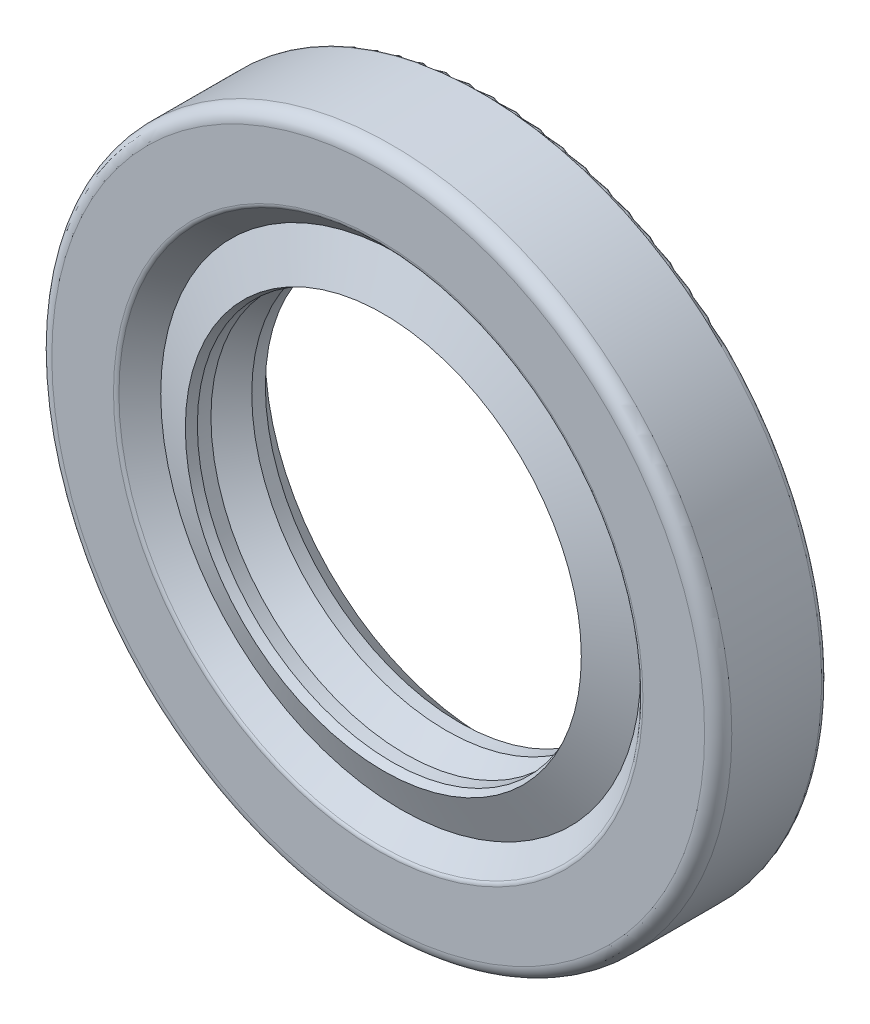
ISO-10303-21;
HEADER;
FILE_DESCRIPTION(('STEP AP214'),'2;1');
FILE_NAME('part.step','',(''),(''),'','','');
FILE_SCHEMA(('AUTOMOTIVE_DESIGN { 1 0 10303 214 1 1 1 1 }'));
ENDSEC;
DATA;
#1=APPLICATION_CONTEXT('core data for automotive mechanical design processes');
#2=APPLICATION_PROTOCOL_DEFINITION('international standard','automotive_design',2000,#1);
#3=PRODUCT_CONTEXT('',#1,'mechanical');
#4=PRODUCT('Part','Part','',(#3));
#5=PRODUCT_RELATED_PRODUCT_CATEGORY('part','',(#4));
#6=PRODUCT_DEFINITION_FORMATION('','',#4);
#7=PRODUCT_DEFINITION_CONTEXT('part definition',#1,'design');
#8=PRODUCT_DEFINITION('design','',#6,#7);
#9=PRODUCT_DEFINITION_SHAPE('','',#8);
#10=(LENGTH_UNIT() NAMED_UNIT(*) SI_UNIT(.MILLI.,.METRE.));
#11=(NAMED_UNIT(*) PLANE_ANGLE_UNIT() SI_UNIT($,.RADIAN.));
#12=(NAMED_UNIT(*) SI_UNIT($,.STERADIAN.) SOLID_ANGLE_UNIT());
#13=UNCERTAINTY_MEASURE_WITH_UNIT(LENGTH_MEASURE(1.E-05),#10,'distance_accuracy_value','');
#14=(GEOMETRIC_REPRESENTATION_CONTEXT(3) GLOBAL_UNCERTAINTY_ASSIGNED_CONTEXT((#13)) GLOBAL_UNIT_ASSIGNED_CONTEXT((#10,
#11,#12)) REPRESENTATION_CONTEXT('',''));
#15=CARTESIAN_POINT('',(0.,0.,0.));
#16=DIRECTION('',(0.,0.,1.));
#17=DIRECTION('',(1.,0.,0.));
#18=AXIS2_PLACEMENT_3D('',#15,#16,#17);
#19=CARTESIAN_POINT('',(0.,0.,-2.75));
#20=DIRECTION('',(0.,0.,1.));
#21=DIRECTION('',(1.,0.,0.));
#22=AXIS2_PLACEMENT_3D('',#19,#20,#21);
#23=TOROIDAL_SURFACE('',#22,9.0920310216783,0.75);
#24=ADVANCED_FACE('P0_F14',(),#23,.T.);
#25=CLOSED_SHELL('',(#24));
#26=MANIFOLD_SOLID_BREP('P0_B1',#25);
#27=CARTESIAN_POINT('',(0.,0.,-3.43431457505076));
#28=DIRECTION('',(0.,0.,1.));
#29=DIRECTION('',(0.,-1.,0.));
#30=AXIS2_PLACEMENT_3D('',#27,#28,#29);
#31=CONICAL_SURFACE('',#30,8.71568542494929,0.785398163397447);
#32=CARTESIAN_POINT('',(0.,0.,-3.43431457505076));
#33=DIRECTION('',(0.,0.,-1.));
#34=DIRECTION('',(-1.,0.,0.));
#35=AXIS2_PLACEMENT_3D('',#32,#33,#34);
#36=CIRCLE('',#35,8.71568542494929);
#37=CARTESIAN_POINT('',(-8.71568542494929,0.,-3.43431457505076));
#38=VERTEX_POINT('',#37);
#39=EDGE_CURVE('P1_E321',#38,#38,#36,.F.);
#40=ORIENTED_EDGE('',*,*,#39,.F.);
#41=EDGE_LOOP('',(#40));
#42=FACE_BOUND('',#41,.T.);
#43=CARTESIAN_POINT('',(0.,0.,-4.));
#44=DIRECTION('',(0.,0.,-1.));
#45=DIRECTION('',(-1.,0.,0.));
#46=AXIS2_PLACEMENT_3D('',#43,#44,#45);
#47=CIRCLE('',#46,8.15000000000005);
#48=CARTESIAN_POINT('',(-8.15000000000005,0.,-4.));
#49=VERTEX_POINT('',#48);
#50=EDGE_CURVE('P1_E318',#49,#49,#47,.F.);
#51=ORIENTED_EDGE('',*,*,#50,.T.);
#52=EDGE_LOOP('',(#51));
#53=FACE_BOUND('',#52,.T.);
#54=ADVANCED_FACE('P1_F17',(#42,#53),#31,.T.);
#55=CARTESIAN_POINT('',(0.,0.,-3.43431457505076));
#56=DIRECTION('',(0.,0.,-1.));
#57=DIRECTION('',(0.,1.,0.));
#58=AXIS2_PLACEMENT_3D('',#55,#56,#57);
#59=CONICAL_SURFACE('',#58,8.71568542494929,0.78539816339745);
#60=CARTESIAN_POINT('',(0.,0.,-2.75000000000004));
#61=DIRECTION('',(0.,0.,1.));
#62=DIRECTION('',(1.,0.,0.));
#63=AXIS2_PLACEMENT_3D('',#60,#61,#62);
#64=CIRCLE('',#63,8.03137084989851);
#65=CARTESIAN_POINT('',(8.03137084989851,0.,-2.75000000000003));
#66=VERTEX_POINT('',#65);
#67=EDGE_CURVE('P1_E315',#66,#66,#64,.T.);
#68=ORIENTED_EDGE('',*,*,#67,.F.);
#69=EDGE_LOOP('',(#68));
#70=FACE_BOUND('',#69,.T.);
#71=ORIENTED_EDGE('',*,*,#39,.T.);
#72=EDGE_LOOP('',(#71));
#73=FACE_BOUND('',#72,.T.);
#74=ADVANCED_FACE('P1_F114',(#70,#73),#59,.T.);
#75=CARTESIAN_POINT('',(0.,0.,-4.));
#76=DIRECTION('',(0.,0.,-1.));
#77=DIRECTION('',(0.,1.,0.));
#78=AXIS2_PLACEMENT_3D('',#75,#76,#77);
#79=CONICAL_SURFACE('',#78,8.15000000000005,0.78539816339745);
#80=CARTESIAN_POINT('',(0.,0.,-3.));
#81=DIRECTION('',(0.,0.,1.));
#82=DIRECTION('',(0.,-1.,0.));
#83=AXIS2_PLACEMENT_3D('',#80,#81,#82);
#84=CIRCLE('',#83,7.15000000000005);
#85=CARTESIAN_POINT('',(0.,-7.15000000000005,-3.00000000000001));
#86=VERTEX_POINT('',#85);
#87=EDGE_CURVE('P1_E312',#86,#86,#84,.T.);
#88=ORIENTED_EDGE('',*,*,#87,.T.);
#89=EDGE_LOOP('',(#88));
#90=FACE_BOUND('',#89,.T.);
#91=ORIENTED_EDGE('',*,*,#50,.F.);
#92=EDGE_LOOP('',(#91));
#93=FACE_BOUND('',#92,.T.);
#94=ADVANCED_FACE('P1_F111',(#90,#93),#79,.F.);
#95=CARTESIAN_POINT('',(0.,0.,-0.800000000000002));
#96=DIRECTION('',(0.,0.,1.));
#97=DIRECTION('',(0.,-1.,0.));
#98=AXIS2_PLACEMENT_3D('',#95,#96,#97);
#99=CONICAL_SURFACE('',#98,9.98137084989855,0.785398163397451);
#100=ORIENTED_EDGE('',*,*,#67,.T.);
#101=EDGE_LOOP('',(#100));
#102=FACE_BOUND('',#101,.T.);
#103=CARTESIAN_POINT('',(0.,0.,-0.800000000000002));
#104=DIRECTION('',(0.,0.,1.));
#105=DIRECTION('',(0.,-1.,0.));
#106=AXIS2_PLACEMENT_3D('',#103,#104,#105);
#107=CIRCLE('',#106,9.98137084989855);
#108=CARTESIAN_POINT('',(0.,-9.98137084989855,-0.800000000000003));
#109=VERTEX_POINT('',#108);
#110=EDGE_CURVE('P1_E311',#109,#109,#107,.T.);
#111=ORIENTED_EDGE('',*,*,#110,.F.);
#112=EDGE_LOOP('',(#111));
#113=FACE_BOUND('',#112,.T.);
#114=ADVANCED_FACE('P1_F107',(#102,#113),#99,.T.);
#115=CARTESIAN_POINT('',(0.,0.,0.));
#116=DIRECTION('',(0.,0.,1.));
#117=DIRECTION('',(0.,-1.,0.));
#118=AXIS2_PLACEMENT_3D('',#115,#116,#117);
#119=CYLINDRICAL_SURFACE('',#118,7.15000000000005);
#120=ORIENTED_EDGE('',*,*,#87,.F.);
#121=EDGE_LOOP('',(#120));
#122=FACE_BOUND('',#121,.T.);
#123=CARTESIAN_POINT('',(0.,0.,-2.50000000000001));
#124=DIRECTION('',(0.,0.,1.));
#125=DIRECTION('',(1.,0.,0.));
#126=AXIS2_PLACEMENT_3D('',#123,#124,#125);
#127=CIRCLE('',#126,7.15000000000005);
#128=CARTESIAN_POINT('',(7.15000000000005,0.,-2.5));
#129=VERTEX_POINT('',#128);
#130=EDGE_CURVE('P1_E308',#129,#129,#127,.T.);
#131=ORIENTED_EDGE('',*,*,#130,.T.);
#132=EDGE_LOOP('',(#131));
#133=FACE_BOUND('',#132,.T.);
#134=ADVANCED_FACE('P1_F103',(#122,#133),#119,.F.);
#135=CARTESIAN_POINT('',(0.,0.,-0.800000000000002));
#136=DIRECTION('',(0.,0.,-1.));
#137=DIRECTION('',(0.,1.,0.));
#138=AXIS2_PLACEMENT_3D('',#135,#136,#137);
#139=PLANE('',#138);
#140=CARTESIAN_POINT('',(0.,0.,-0.800000000000002));
#141=DIRECTION('',(0.,0.,1.));
#142=DIRECTION('',(0.,-1.,0.));
#143=AXIS2_PLACEMENT_3D('',#140,#141,#142);
#144=CIRCLE('',#143,11.7000000000001);
#145=CARTESIAN_POINT('',(0.,-11.7000000000001,-0.800000000000003));
#146=VERTEX_POINT('',#145);
#147=EDGE_CURVE('P1_E305',#146,#146,#144,.F.);
#148=ORIENTED_EDGE('',*,*,#147,.T.);
#149=EDGE_LOOP('',(#148));
#150=FACE_BOUND('',#149,.T.);
#151=ORIENTED_EDGE('',*,*,#110,.T.);
#152=EDGE_LOOP('',(#151));
#153=FACE_BOUND('',#152,.T.);
#154=ADVANCED_FACE('P1_F99',(#150,#153),#139,.T.);
#155=CARTESIAN_POINT('',(0.,0.,-1.43933982822018));
#156=DIRECTION('',(0.,0.,1.));
#157=DIRECTION('',(0.,-1.,0.));
#158=AXIS2_PLACEMENT_3D('',#155,#156,#157);
#159=CONICAL_SURFACE('',#158,8.21066017177988,0.785398163397452);
#160=ORIENTED_EDGE('',*,*,#130,.F.);
#161=EDGE_LOOP('',(#160));
#162=FACE_BOUND('',#161,.T.);
#163=CARTESIAN_POINT('',(0.,0.,-1.43933982822018));
#164=DIRECTION('',(0.,0.,-1.));
#165=DIRECTION('',(-1.,0.,0.));
#166=AXIS2_PLACEMENT_3D('',#163,#164,#165);
#167=CIRCLE('',#166,8.21066017177987);
#168=CARTESIAN_POINT('',(-8.21066017177987,0.,-1.43933982822018));
#169=VERTEX_POINT('',#168);
#170=EDGE_CURVE('P1_E302',#169,#169,#167,.F.);
#171=ORIENTED_EDGE('',*,*,#170,.T.);
#172=EDGE_LOOP('',(#171));
#173=FACE_BOUND('',#172,.T.);
#174=ADVANCED_FACE('P1_F95',(#162,#173),#159,.F.);
#175=CARTESIAN_POINT('',(0.,0.,0.));
#176=DIRECTION('',(0.,0.,1.));
#177=DIRECTION('',(0.,-1.,0.));
#178=AXIS2_PLACEMENT_3D('',#175,#176,#177);
#179=CYLINDRICAL_SURFACE('',#178,11.7000000000001);
#180=CARTESIAN_POINT('',(0.,0.,-3.8));
#181=DIRECTION('',(0.,0.,-1.));
#182=DIRECTION('',(-1.,0.,0.));
#183=AXIS2_PLACEMENT_3D('',#180,#181,#182);
#184=CIRCLE('',#183,11.7);
#185=CARTESIAN_POINT('',(-11.7,0.,-3.8));
#186=VERTEX_POINT('',#185);
#187=EDGE_CURVE('P1_E300',#186,#186,#184,.F.);
#188=ORIENTED_EDGE('',*,*,#187,.F.);
#189=EDGE_LOOP('',(#188));
#190=FACE_BOUND('',#189,.T.);
#191=ORIENTED_EDGE('',*,*,#147,.F.);
#192=EDGE_LOOP('',(#191));
#193=FACE_BOUND('',#192,.T.);
#194=ADVANCED_FACE('P1_F91',(#190,#193),#179,.F.);
#195=CARTESIAN_POINT('',(0.,0.,-1.43933982822018));
#196=DIRECTION('',(0.,0.,-1.));
#197=DIRECTION('',(0.,1.,0.));
#198=AXIS2_PLACEMENT_3D('',#195,#196,#197);
#199=CONICAL_SURFACE('',#198,8.21066017177987,1.17809724509617);
#200=CARTESIAN_POINT('',(0.,0.,-1.));
#201=DIRECTION('',(0.,0.,1.));
#202=DIRECTION('',(0.,-1.,0.));
#203=AXIS2_PLACEMENT_3D('',#200,#201,#202);
#204=CIRCLE('',#203,7.15000000000005);
#205=CARTESIAN_POINT('',(0.,-7.15000000000005,-1.));
#206=VERTEX_POINT('',#205);
#207=EDGE_CURVE('P1_E61',#206,#206,#204,.T.);
#208=ORIENTED_EDGE('',*,*,#207,.T.);
#209=EDGE_LOOP('',(#208));
#210=FACE_BOUND('',#209,.T.);
#211=ORIENTED_EDGE('',*,*,#170,.F.);
#212=EDGE_LOOP('',(#211));
#213=FACE_BOUND('',#212,.T.);
#214=ADVANCED_FACE('P1_F85',(#210,#213),#199,.F.);
#215=CARTESIAN_POINT('',(0.,0.,-3.8));
#216=DIRECTION('',(0.,0.,-1.));
#217=DIRECTION('',(-1.,0.,0.));
#218=AXIS2_PLACEMENT_3D('',#215,#216,#217);
#219=TOROIDAL_SURFACE('',#218,11.9,0.2);
#220=ORIENTED_EDGE('',*,*,#187,.T.);
#221=EDGE_LOOP('',(#220));
#222=FACE_BOUND('',#221,.T.);
#223=CARTESIAN_POINT('',(0.,0.,-4.));
#224=DIRECTION('',(0.,0.,-1.));
#225=DIRECTION('',(-1.,0.,0.));
#226=AXIS2_PLACEMENT_3D('',#223,#224,#225);
#227=CIRCLE('',#226,11.9);
#228=CARTESIAN_POINT('',(11.9000000000001,0.,-4.));
#229=VERTEX_POINT('',#228);
#230=CARTESIAN_POINT('',(-11.9000000000001,0.,-4.));
#231=VERTEX_POINT('',#230);
#232=EDGE_CURVE('P1_E54',#229,#231,#227,.F.);
#233=ORIENTED_EDGE('',*,*,#232,.F.);
#234=CARTESIAN_POINT('',(0.,0.,-4.));
#235=DIRECTION('',(0.,0.,-1.));
#236=DIRECTION('',(1.,0.,0.));
#237=AXIS2_PLACEMENT_3D('',#234,#235,#236);
#238=CIRCLE('',#237,11.9);
#239=EDGE_CURVE('P1_E57',#231,#229,#238,.F.);
#240=ORIENTED_EDGE('',*,*,#239,.F.);
#241=EDGE_LOOP('',(#233,#240));
#242=FACE_BOUND('',#241,.T.);
#243=ADVANCED_FACE('P1_F65',(#222,#242),#219,.T.);
#244=CARTESIAN_POINT('',(0.,0.,0.));
#245=DIRECTION('',(0.,0.,1.));
#246=DIRECTION('',(0.,-1.,0.));
#247=AXIS2_PLACEMENT_3D('',#244,#245,#246);
#248=CYLINDRICAL_SURFACE('',#247,7.15000000000005);
#249=ORIENTED_EDGE('',*,*,#207,.F.);
#250=EDGE_LOOP('',(#249));
#251=FACE_BOUND('',#250,.T.);
#252=CARTESIAN_POINT('',(0.,0.,-0.5));
#253=DIRECTION('',(0.,0.,1.));
#254=DIRECTION('',(1.,0.,0.));
#255=AXIS2_PLACEMENT_3D('',#252,#253,#254);
#256=CIRCLE('',#255,7.15000000000005);
#257=CARTESIAN_POINT('',(7.15000000000005,0.,-0.500000000000001));
#258=VERTEX_POINT('',#257);
#259=EDGE_CURVE('P1_E66',#258,#258,#256,.T.);
#260=ORIENTED_EDGE('',*,*,#259,.T.);
#261=EDGE_LOOP('',(#260));
#262=FACE_BOUND('',#261,.T.);
#263=ADVANCED_FACE('P1_F84',(#251,#262),#248,.F.);
#264=CARTESIAN_POINT('',(0.,0.,-4.));
#265=DIRECTION('',(0.,0.,-1.));
#266=DIRECTION('',(0.,1.,0.));
#267=AXIS2_PLACEMENT_3D('',#264,#265,#266);
#268=PLANE('',#267);
#269=CARTESIAN_POINT('',(0.,0.,-4.));
#270=DIRECTION('',(0.,0.,1.));
#271=DIRECTION('',(1.,0.,0.));
#272=AXIS2_PLACEMENT_3D('',#269,#270,#271);
#273=CIRCLE('',#272,12.3);
#274=CARTESIAN_POINT('',(12.3,0.,-4.));
#275=VERTEX_POINT('',#274);
#276=CARTESIAN_POINT('',(-12.3,0.,-4.));
#277=VERTEX_POINT('',#276);
#278=EDGE_CURVE('P1_E208',#275,#277,#273,.T.);
#279=ORIENTED_EDGE('',*,*,#278,.F.);
#280=CARTESIAN_POINT('',(0.,0.,-4.));
#281=DIRECTION('',(0.,0.,1.));
#282=DIRECTION('',(-1.,0.,0.));
#283=AXIS2_PLACEMENT_3D('',#280,#281,#282);
#284=CIRCLE('',#283,12.3);
#285=EDGE_CURVE('P1_E235',#277,#275,#284,.T.);
#286=ORIENTED_EDGE('',*,*,#285,.F.);
#287=EDGE_LOOP('',(#279,#286));
#288=FACE_BOUND('',#287,.T.);
#289=ORIENTED_EDGE('',*,*,#239,.T.);
#290=ORIENTED_EDGE('',*,*,#232,.T.);
#291=EDGE_LOOP('',(#289,#290));
#292=FACE_BOUND('',#291,.T.);
#293=ADVANCED_FACE('P1_F59',(#288,#292),#268,.T.);
#294=CARTESIAN_POINT('',(0.,0.,-0.187673069287628));
#295=DIRECTION('',(0.,0.,1.));
#296=DIRECTION('',(0.,-1.,0.));
#297=AXIS2_PLACEMENT_3D('',#294,#295,#296);
#298=CONICAL_SURFACE('',#297,7.27937005059548,0.392699081698731);
#299=ORIENTED_EDGE('',*,*,#259,.F.);
#300=EDGE_LOOP('',(#299));
#301=FACE_BOUND('',#300,.T.);
#302=CARTESIAN_POINT('',(0.,0.,-0.187673069287591));
#303=DIRECTION('',(0.,0.,-1.));
#304=DIRECTION('',(-1.,0.,0.));
#305=AXIS2_PLACEMENT_3D('',#302,#303,#304);
#306=CIRCLE('',#305,7.27937005059545);
#307=CARTESIAN_POINT('',(-7.27937005059545,0.,-0.187673069287592));
#308=VERTEX_POINT('',#307);
#309=EDGE_CURVE('P1_E233',#308,#308,#306,.T.);
#310=ORIENTED_EDGE('',*,*,#309,.F.);
#311=EDGE_LOOP('',(#310));
#312=FACE_BOUND('',#311,.T.);
#313=ADVANCED_FACE('P1_F225',(#301,#312),#298,.F.);
#314=CARTESIAN_POINT('',(0.,0.,-3.8));
#315=DIRECTION('',(0.,0.,-1.));
#316=DIRECTION('',(-1.,0.,0.));
#317=AXIS2_PLACEMENT_3D('',#314,#315,#316);
#318=TOROIDAL_SURFACE('',#317,12.3,0.2);
#319=CARTESIAN_POINT('',(0.,0.,-3.8));
#320=DIRECTION('',(0.,0.,1.));
#321=DIRECTION('',(0.,-1.,0.));
#322=AXIS2_PLACEMENT_3D('',#319,#320,#321);
#323=CIRCLE('',#322,12.5000000000001);
#324=CARTESIAN_POINT('',(0.,-12.5000000000001,-3.8));
#325=VERTEX_POINT('',#324);
#326=EDGE_CURVE('P1_E231',#325,#325,#323,.T.);
#327=ORIENTED_EDGE('',*,*,#326,.F.);
#328=EDGE_LOOP('',(#327));
#329=FACE_BOUND('',#328,.T.);
#330=ORIENTED_EDGE('',*,*,#285,.T.);
#331=ORIENTED_EDGE('',*,*,#278,.T.);
#332=EDGE_LOOP('',(#330,#331));
#333=FACE_BOUND('',#332,.T.);
#334=ADVANCED_FACE('P1_F213',(#329,#333),#318,.T.);
#335=CARTESIAN_POINT('',(0.,0.,-0.827046336436042));
#336=DIRECTION('',(0.,0.,-1.));
#337=DIRECTION('',(0.,1.,0.));
#338=AXIS2_PLACEMENT_3D('',#335,#336,#337);
#339=CONICAL_SURFACE('',#338,8.82295366356402,1.17809724509617);
#340=CARTESIAN_POINT('',(0.,0.,-0.827046336436047));
#341=DIRECTION('',(0.,0.,1.));
#342=DIRECTION('',(1.,0.,0.));
#343=AXIS2_PLACEMENT_3D('',#340,#341,#342);
#344=CIRCLE('',#343,8.82295366356403);
#345=CARTESIAN_POINT('',(8.82295366356403,0.,-0.827046336436045));
#346=VERTEX_POINT('',#345);
#347=EDGE_CURVE('P1_E239',#346,#346,#344,.T.);
#348=ORIENTED_EDGE('',*,*,#347,.T.);
#349=EDGE_LOOP('',(#348));
#350=FACE_BOUND('',#349,.T.);
#351=ORIENTED_EDGE('',*,*,#309,.T.);
#352=EDGE_LOOP('',(#351));
#353=FACE_BOUND('',#352,.T.);
#354=ADVANCED_FACE('P1_F224',(#350,#353),#339,.T.);
#355=CARTESIAN_POINT('',(0.,0.,0.));
#356=DIRECTION('',(0.,0.,1.));
#357=DIRECTION('',(0.,-1.,0.));
#358=AXIS2_PLACEMENT_3D('',#355,#356,#357);
#359=CYLINDRICAL_SURFACE('',#358,12.5000000000001);
#360=ORIENTED_EDGE('',*,*,#326,.T.);
#361=EDGE_LOOP('',(#360));
#362=FACE_BOUND('',#361,.T.);
#363=CARTESIAN_POINT('',(0.,0.,-0.5));
#364=DIRECTION('',(0.,0.,-1.));
#365=DIRECTION('',(-1.,0.,0.));
#366=AXIS2_PLACEMENT_3D('',#363,#364,#365);
#367=CIRCLE('',#366,12.5);
#368=CARTESIAN_POINT('',(-12.5,0.,-0.500000000000002));
#369=VERTEX_POINT('',#368);
#370=EDGE_CURVE('P1_E340',#369,#369,#367,.F.);
#371=ORIENTED_EDGE('',*,*,#370,.F.);
#372=EDGE_LOOP('',(#371));
#373=FACE_BOUND('',#372,.T.);
#374=ADVANCED_FACE('P1_F350',(#362,#373),#359,.T.);
#375=CARTESIAN_POINT('',(0.,0.,-0.0585786437626941));
#376=DIRECTION('',(0.,0.,1.));
#377=DIRECTION('',(0.,-1.,0.));
#378=AXIS2_PLACEMENT_3D('',#375,#376,#377);
#379=CONICAL_SURFACE('',#378,9.59142135623738,0.78539816339745);
#380=ORIENTED_EDGE('',*,*,#347,.F.);
#381=EDGE_LOOP('',(#380));
#382=FACE_BOUND('',#381,.T.);
#383=CARTESIAN_POINT('',(0.,0.,-0.0585786437626626));
#384=DIRECTION('',(0.,0.,-1.));
#385=DIRECTION('',(-1.,0.,0.));
#386=AXIS2_PLACEMENT_3D('',#383,#384,#385);
#387=CIRCLE('',#386,9.59142135623735);
#388=CARTESIAN_POINT('',(-9.59142135623735,0.,-0.0585786437626636));
#389=VERTEX_POINT('',#388);
#390=EDGE_CURVE('P1_E338',#389,#389,#387,.T.);
#391=ORIENTED_EDGE('',*,*,#390,.F.);
#392=EDGE_LOOP('',(#391));
#393=FACE_BOUND('',#392,.T.);
#394=ADVANCED_FACE('P1_F186',(#382,#393),#379,.F.);
#395=CARTESIAN_POINT('',(0.,0.,-0.5));
#396=DIRECTION('',(0.,0.,-1.));
#397=DIRECTION('',(-1.,0.,0.));
#398=AXIS2_PLACEMENT_3D('',#395,#396,#397);
#399=TOROIDAL_SURFACE('',#398,12.,0.5);
#400=CARTESIAN_POINT('',(0.,0.,0.));
#401=DIRECTION('',(0.,0.,-1.));
#402=DIRECTION('',(-1.,0.,0.));
#403=AXIS2_PLACEMENT_3D('',#400,#401,#402);
#404=CIRCLE('',#403,12.);
#405=CARTESIAN_POINT('',(-12.,0.,0.));
#406=VERTEX_POINT('',#405);
#407=CARTESIAN_POINT('',(12.,0.,0.));
#408=VERTEX_POINT('',#407);
#409=EDGE_CURVE('P1_E337',#406,#408,#404,.T.);
#410=ORIENTED_EDGE('',*,*,#409,.T.);
#411=CARTESIAN_POINT('',(0.,0.,0.));
#412=DIRECTION('',(0.,0.,-1.));
#413=DIRECTION('',(1.,0.,0.));
#414=AXIS2_PLACEMENT_3D('',#411,#412,#413);
#415=CIRCLE('',#414,12.);
#416=EDGE_CURVE('P1_E336',#408,#406,#415,.T.);
#417=ORIENTED_EDGE('',*,*,#416,.T.);
#418=EDGE_LOOP('',(#410,#417));
#419=FACE_BOUND('',#418,.T.);
#420=ORIENTED_EDGE('',*,*,#370,.T.);
#421=EDGE_LOOP('',(#420));
#422=FACE_BOUND('',#421,.T.);
#423=ADVANCED_FACE('P1_F132',(#419,#422),#399,.T.);
#424=CARTESIAN_POINT('',(0.,0.,-0.199999999999999));
#425=DIRECTION('',(0.,0.,-1.));
#426=DIRECTION('',(-1.,0.,0.));
#427=AXIS2_PLACEMENT_3D('',#424,#425,#426);
#428=TOROIDAL_SURFACE('',#427,9.73284271247463,0.2);
#429=CARTESIAN_POINT('',(0.,0.,0.));
#430=DIRECTION('',(0.,0.,1.));
#431=DIRECTION('',(-1.,0.,0.));
#432=AXIS2_PLACEMENT_3D('',#429,#430,#431);
#433=CIRCLE('',#432,9.73284271247466);
#434=CARTESIAN_POINT('',(-9.73284271247468,0.,0.));
#435=VERTEX_POINT('',#434);
#436=CARTESIAN_POINT('',(9.73284271247468,0.,0.));
#437=VERTEX_POINT('',#436);
#438=EDGE_CURVE('P1_E28',#435,#437,#433,.T.);
#439=ORIENTED_EDGE('',*,*,#438,.T.);
#440=CARTESIAN_POINT('',(0.,0.,0.));
#441=DIRECTION('',(0.,0.,1.));
#442=DIRECTION('',(1.,0.,0.));
#443=AXIS2_PLACEMENT_3D('',#440,#441,#442);
#444=CIRCLE('',#443,9.73284271247466);
#445=EDGE_CURVE('P1_E11',#437,#435,#444,.T.);
#446=ORIENTED_EDGE('',*,*,#445,.T.);
#447=EDGE_LOOP('',(#439,#446));
#448=FACE_BOUND('',#447,.T.);
#449=ORIENTED_EDGE('',*,*,#390,.T.);
#450=EDGE_LOOP('',(#449));
#451=FACE_BOUND('',#450,.T.);
#452=ADVANCED_FACE('P1_F127',(#448,#451),#428,.T.);
#453=CARTESIAN_POINT('',(0.,0.,0.));
#454=DIRECTION('',(0.,0.,-1.));
#455=DIRECTION('',(0.,1.,0.));
#456=AXIS2_PLACEMENT_3D('',#453,#454,#455);
#457=PLANE('',#456);
#458=ORIENTED_EDGE('',*,*,#438,.F.);
#459=ORIENTED_EDGE('',*,*,#445,.F.);
#460=EDGE_LOOP('',(#458,#459));
#461=FACE_BOUND('',#460,.T.);
#462=ORIENTED_EDGE('',*,*,#409,.F.);
#463=ORIENTED_EDGE('',*,*,#416,.F.);
#464=EDGE_LOOP('',(#462,#463));
#465=FACE_BOUND('',#464,.T.);
#466=ADVANCED_FACE('P1_F125',(#461,#465),#457,.F.);
#467=CLOSED_SHELL('',(#54,#74,#94,#114,#134,#154,#174,#194,#214,#243,#263,#293,#313,#334,#354,
#374,#394,#423,#452,#466));
#468=MANIFOLD_SOLID_BREP('P1_B1',#467);
#469=ADVANCED_BREP_SHAPE_REPRESENTATION('',(#18,#26,#468),#14);
#470=SHAPE_DEFINITION_REPRESENTATION(#9,#469);
ENDSEC;
END-ISO-10303-21;
